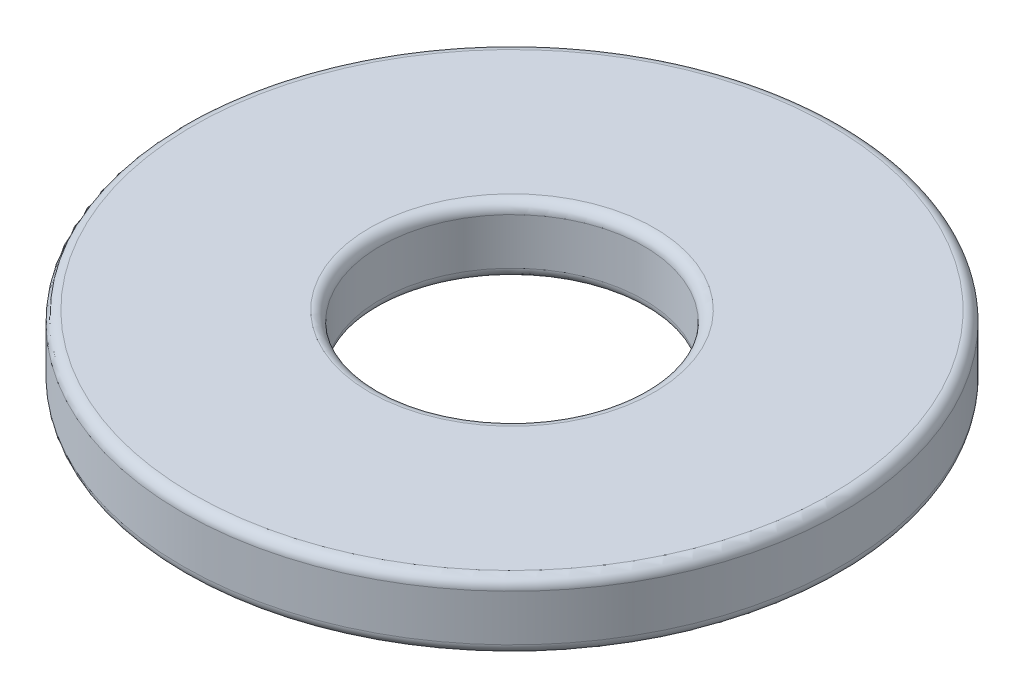
ISO-10303-21;
HEADER;
FILE_DESCRIPTION(('STEP AP214'),'2;1');
FILE_NAME('part.step','',(''),(''),'','','');
FILE_SCHEMA(('AUTOMOTIVE_DESIGN { 1 0 10303 214 1 1 1 1 }'));
ENDSEC;
DATA;
#1=APPLICATION_CONTEXT('core data for automotive mechanical design processes');
#2=APPLICATION_PROTOCOL_DEFINITION('international standard','automotive_design',2000,#1);
#3=PRODUCT_CONTEXT('',#1,'mechanical');
#4=PRODUCT('Part','Part','',(#3));
#5=PRODUCT_RELATED_PRODUCT_CATEGORY('part','',(#4));
#6=PRODUCT_DEFINITION_FORMATION('','',#4);
#7=PRODUCT_DEFINITION_CONTEXT('part definition',#1,'design');
#8=PRODUCT_DEFINITION('design','',#6,#7);
#9=PRODUCT_DEFINITION_SHAPE('','',#8);
#10=(LENGTH_UNIT() NAMED_UNIT(*) SI_UNIT(.MILLI.,.METRE.));
#11=(NAMED_UNIT(*) PLANE_ANGLE_UNIT() SI_UNIT($,.RADIAN.));
#12=(NAMED_UNIT(*) SI_UNIT($,.STERADIAN.) SOLID_ANGLE_UNIT());
#13=UNCERTAINTY_MEASURE_WITH_UNIT(LENGTH_MEASURE(1.E-05),#10,'distance_accuracy_value','');
#14=(GEOMETRIC_REPRESENTATION_CONTEXT(3) GLOBAL_UNCERTAINTY_ASSIGNED_CONTEXT((#13)) GLOBAL_UNIT_ASSIGNED_CONTEXT((#10,
#11,#12)) REPRESENTATION_CONTEXT('',''));
#15=CARTESIAN_POINT('',(0.,0.,0.));
#16=DIRECTION('',(0.,0.,1.));
#17=DIRECTION('',(1.,0.,0.));
#18=AXIS2_PLACEMENT_3D('',#15,#16,#17);
#19=CARTESIAN_POINT('',(0.,0.8128,0.));
#20=DIRECTION('',(0.,1.,0.));
#21=DIRECTION('',(0.,0.,1.));
#22=AXIS2_PLACEMENT_3D('',#19,#20,#21);
#23=PLANE('',#22);
#24=CARTESIAN_POINT('',(0.,0.8128,0.));
#25=DIRECTION('',(0.,1.,0.));
#26=DIRECTION('',(0.,0.,1.));
#27=AXIS2_PLACEMENT_3D('',#24,#25,#26);
#28=CIRCLE('',#27,1.7145);
#29=CARTESIAN_POINT('',(0.,0.8128,1.7145));
#30=VERTEX_POINT('',#29);
#31=EDGE_CURVE('E42',#30,#30,#28,.F.);
#32=ORIENTED_EDGE('',*,*,#31,.T.);
#33=EDGE_LOOP('',(#32));
#34=FACE_BOUND('',#33,.T.);
#35=CARTESIAN_POINT('',(0.,0.8128,0.));
#36=DIRECTION('',(0.,1.,0.));
#37=DIRECTION('',(0.,0.,1.));
#38=AXIS2_PLACEMENT_3D('',#35,#36,#37);
#39=CIRCLE('',#38,3.84175);
#40=CARTESIAN_POINT('',(0.,0.8128,3.84175));
#41=VERTEX_POINT('',#40);
#42=EDGE_CURVE('E46',#41,#41,#39,.T.);
#43=ORIENTED_EDGE('',*,*,#42,.T.);
#44=EDGE_LOOP('',(#43));
#45=FACE_BOUND('',#44,.T.);
#46=ADVANCED_FACE('F31',(#34,#45),#23,.T.);
#47=CARTESIAN_POINT('',(0.,0.,0.));
#48=DIRECTION('',(0.,1.,0.));
#49=DIRECTION('',(0.,0.,1.));
#50=AXIS2_PLACEMENT_3D('',#47,#48,#49);
#51=PLANE('',#50);
#52=CARTESIAN_POINT('',(0.,0.,0.));
#53=DIRECTION('',(0.,1.,0.));
#54=DIRECTION('',(0.,0.,1.));
#55=AXIS2_PLACEMENT_3D('',#52,#53,#54);
#56=CIRCLE('',#55,1.7145);
#57=CARTESIAN_POINT('',(0.,0.,1.7145));
#58=VERTEX_POINT('',#57);
#59=EDGE_CURVE('E57',#58,#58,#56,.T.);
#60=ORIENTED_EDGE('',*,*,#59,.T.);
#61=EDGE_LOOP('',(#60));
#62=FACE_BOUND('',#61,.T.);
#63=CARTESIAN_POINT('',(0.,0.,0.));
#64=DIRECTION('',(0.,1.,0.));
#65=DIRECTION('',(0.,0.,1.));
#66=AXIS2_PLACEMENT_3D('',#63,#64,#65);
#67=CIRCLE('',#66,3.84175);
#68=CARTESIAN_POINT('',(0.,0.,3.84175));
#69=VERTEX_POINT('',#68);
#70=EDGE_CURVE('E60',#69,#69,#67,.F.);
#71=ORIENTED_EDGE('',*,*,#70,.T.);
#72=EDGE_LOOP('',(#71));
#73=FACE_BOUND('',#72,.T.);
#74=ADVANCED_FACE('F64',(#62,#73),#51,.F.);
#75=CARTESIAN_POINT('',(0.,0.8128,0.));
#76=DIRECTION('',(0.,-1.,0.));
#77=DIRECTION('',(0.,0.,-1.));
#78=AXIS2_PLACEMENT_3D('',#75,#76,#77);
#79=CYLINDRICAL_SURFACE('',#78,3.96875);
#80=CARTESIAN_POINT('',(0.,0.127,0.));
#81=DIRECTION('',(0.,1.,0.));
#82=DIRECTION('',(0.,0.,1.));
#83=AXIS2_PLACEMENT_3D('',#80,#81,#82);
#84=CIRCLE('',#83,3.96875);
#85=CARTESIAN_POINT('',(0.,0.127,3.96875));
#86=VERTEX_POINT('',#85);
#87=EDGE_CURVE('E10',#86,#86,#84,.T.);
#88=ORIENTED_EDGE('',*,*,#87,.T.);
#89=EDGE_LOOP('',(#88));
#90=FACE_BOUND('',#89,.T.);
#91=CARTESIAN_POINT('',(0.,0.6858,0.));
#92=DIRECTION('',(0.,1.,0.));
#93=DIRECTION('',(0.,0.,1.));
#94=AXIS2_PLACEMENT_3D('',#91,#92,#93);
#95=CIRCLE('',#94,3.96875);
#96=CARTESIAN_POINT('',(0.,0.6858,3.96875));
#97=VERTEX_POINT('',#96);
#98=EDGE_CURVE('E38',#97,#97,#95,.F.);
#99=ORIENTED_EDGE('',*,*,#98,.T.);
#100=EDGE_LOOP('',(#99));
#101=FACE_BOUND('',#100,.T.);
#102=ADVANCED_FACE('F84',(#90,#101),#79,.T.);
#103=CARTESIAN_POINT('',(0.,0.8128,0.));
#104=DIRECTION('',(0.,-1.,0.));
#105=DIRECTION('',(0.,0.,-1.));
#106=AXIS2_PLACEMENT_3D('',#103,#104,#105);
#107=CYLINDRICAL_SURFACE('',#106,1.5875);
#108=CARTESIAN_POINT('',(0.,0.127,0.));
#109=DIRECTION('',(0.,1.,0.));
#110=DIRECTION('',(0.,0.,1.));
#111=AXIS2_PLACEMENT_3D('',#108,#109,#110);
#112=CIRCLE('',#111,1.5875);
#113=CARTESIAN_POINT('',(0.,0.127,1.5875));
#114=VERTEX_POINT('',#113);
#115=EDGE_CURVE('E51',#114,#114,#112,.F.);
#116=ORIENTED_EDGE('',*,*,#115,.T.);
#117=EDGE_LOOP('',(#116));
#118=FACE_BOUND('',#117,.T.);
#119=CARTESIAN_POINT('',(0.,0.6858,0.));
#120=DIRECTION('',(0.,1.,0.));
#121=DIRECTION('',(0.,0.,1.));
#122=AXIS2_PLACEMENT_3D('',#119,#120,#121);
#123=CIRCLE('',#122,1.5875);
#124=CARTESIAN_POINT('',(0.,0.6858,1.5875));
#125=VERTEX_POINT('',#124);
#126=EDGE_CURVE('E54',#125,#125,#123,.T.);
#127=ORIENTED_EDGE('',*,*,#126,.T.);
#128=EDGE_LOOP('',(#127));
#129=FACE_BOUND('',#128,.T.);
#130=ADVANCED_FACE('F89',(#118,#129),#107,.F.);
#131=CARTESIAN_POINT('',(0.,0.127,0.));
#132=DIRECTION('',(0.,1.,0.));
#133=DIRECTION('',(0.,0.,1.));
#134=AXIS2_PLACEMENT_3D('',#131,#132,#133);
#135=TOROIDAL_SURFACE('',#134,1.7145,0.127);
#136=ORIENTED_EDGE('',*,*,#115,.F.);
#137=EDGE_LOOP('',(#136));
#138=FACE_BOUND('',#137,.T.);
#139=ORIENTED_EDGE('',*,*,#59,.F.);
#140=EDGE_LOOP('',(#139));
#141=FACE_BOUND('',#140,.T.);
#142=ADVANCED_FACE('F75',(#138,#141),#135,.T.);
#143=CARTESIAN_POINT('',(0.,0.6858,0.));
#144=DIRECTION('',(0.,1.,0.));
#145=DIRECTION('',(0.,0.,1.));
#146=AXIS2_PLACEMENT_3D('',#143,#144,#145);
#147=TOROIDAL_SURFACE('',#146,1.7145,0.127);
#148=ORIENTED_EDGE('',*,*,#31,.F.);
#149=EDGE_LOOP('',(#148));
#150=FACE_BOUND('',#149,.T.);
#151=ORIENTED_EDGE('',*,*,#126,.F.);
#152=EDGE_LOOP('',(#151));
#153=FACE_BOUND('',#152,.T.);
#154=ADVANCED_FACE('F69',(#150,#153),#147,.T.);
#155=CARTESIAN_POINT('',(0.,0.127,0.));
#156=DIRECTION('',(0.,1.,0.));
#157=DIRECTION('',(0.,0.,1.));
#158=AXIS2_PLACEMENT_3D('',#155,#156,#157);
#159=TOROIDAL_SURFACE('',#158,3.84175,0.127);
#160=ORIENTED_EDGE('',*,*,#70,.F.);
#161=EDGE_LOOP('',(#160));
#162=FACE_BOUND('',#161,.T.);
#163=ORIENTED_EDGE('',*,*,#87,.F.);
#164=EDGE_LOOP('',(#163));
#165=FACE_BOUND('',#164,.T.);
#166=ADVANCED_FACE('F66',(#162,#165),#159,.T.);
#167=CARTESIAN_POINT('',(0.,0.6858,0.));
#168=DIRECTION('',(0.,1.,0.));
#169=DIRECTION('',(0.,0.,1.));
#170=AXIS2_PLACEMENT_3D('',#167,#168,#169);
#171=TOROIDAL_SURFACE('',#170,3.84175,0.127);
#172=ORIENTED_EDGE('',*,*,#98,.F.);
#173=EDGE_LOOP('',(#172));
#174=FACE_BOUND('',#173,.T.);
#175=ORIENTED_EDGE('',*,*,#42,.F.);
#176=EDGE_LOOP('',(#175));
#177=FACE_BOUND('',#176,.T.);
#178=ADVANCED_FACE('F33',(#174,#177),#171,.T.);
#179=CLOSED_SHELL('',(#46,#74,#102,#130,#142,#154,#166,#178));
#180=MANIFOLD_SOLID_BREP('B2',#179);
#181=ADVANCED_BREP_SHAPE_REPRESENTATION('',(#18,#180),#14);
#182=SHAPE_DEFINITION_REPRESENTATION(#9,#181);
ENDSEC;
END-ISO-10303-21;
